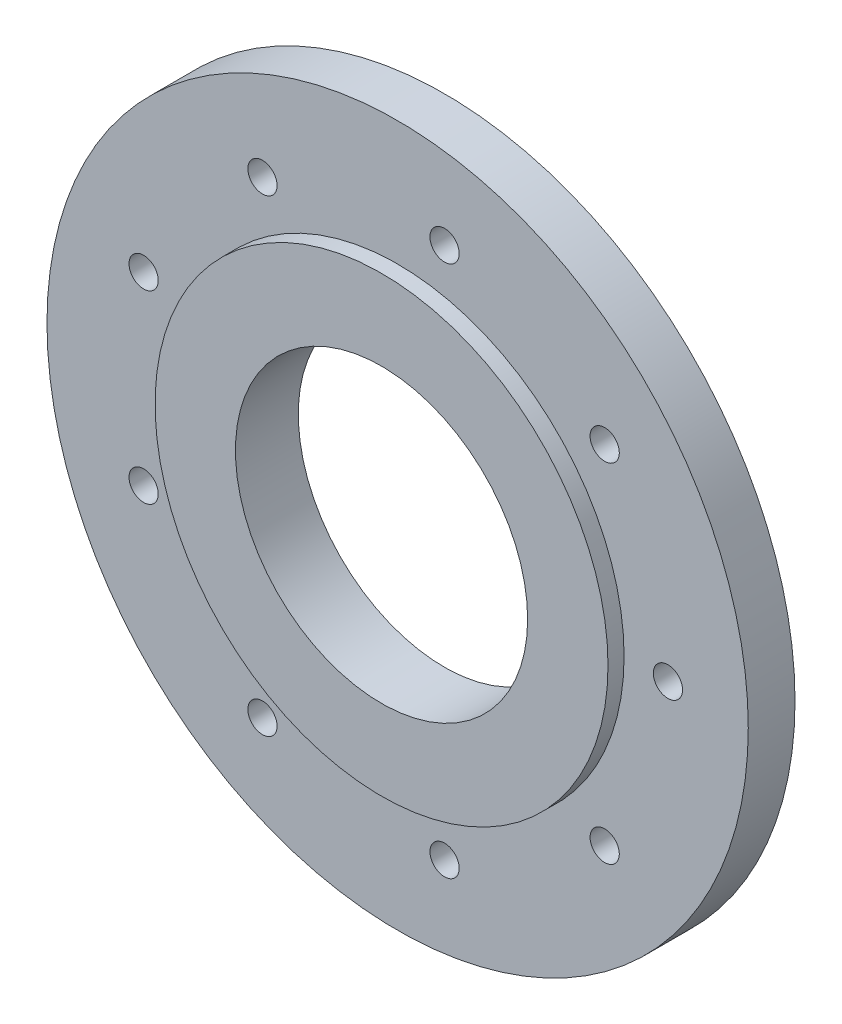
ISO-10303-21;
HEADER;
FILE_DESCRIPTION(('STEP AP214'),'2;1');
FILE_NAME('part.step','',(''),(''),'','','');
FILE_SCHEMA(('AUTOMOTIVE_DESIGN { 1 0 10303 214 1 1 1 1 }'));
ENDSEC;
DATA;
#1=APPLICATION_CONTEXT('core data for automotive mechanical design processes');
#2=APPLICATION_PROTOCOL_DEFINITION('international standard','automotive_design',2000,#1);
#3=PRODUCT_CONTEXT('',#1,'mechanical');
#4=PRODUCT('Part','Part','',(#3));
#5=PRODUCT_RELATED_PRODUCT_CATEGORY('part','',(#4));
#6=PRODUCT_DEFINITION_FORMATION('','',#4);
#7=PRODUCT_DEFINITION_CONTEXT('part definition',#1,'design');
#8=PRODUCT_DEFINITION('design','',#6,#7);
#9=PRODUCT_DEFINITION_SHAPE('','',#8);
#10=(LENGTH_UNIT() NAMED_UNIT(*) SI_UNIT(.MILLI.,.METRE.));
#11=(NAMED_UNIT(*) PLANE_ANGLE_UNIT() SI_UNIT($,.RADIAN.));
#12=(NAMED_UNIT(*) SI_UNIT($,.STERADIAN.) SOLID_ANGLE_UNIT());
#13=UNCERTAINTY_MEASURE_WITH_UNIT(LENGTH_MEASURE(1.E-05),#10,'distance_accuracy_value','');
#14=(GEOMETRIC_REPRESENTATION_CONTEXT(3) GLOBAL_UNCERTAINTY_ASSIGNED_CONTEXT((#13)) GLOBAL_UNIT_ASSIGNED_CONTEXT((#10,
#11,#12)) REPRESENTATION_CONTEXT('',''));
#15=CARTESIAN_POINT('',(0.,0.,0.));
#16=DIRECTION('',(0.,0.,1.));
#17=DIRECTION('',(1.,0.,0.));
#18=AXIS2_PLACEMENT_3D('',#15,#16,#17);
#19=CARTESIAN_POINT('',(0.,0.,21.5));
#20=DIRECTION('',(0.,0.,-1.));
#21=DIRECTION('',(-1.,0.,0.));
#22=AXIS2_PLACEMENT_3D('',#19,#20,#21);
#23=CYLINDRICAL_SURFACE('',#22,120.);
#24=CARTESIAN_POINT('',(0.,0.,0.));
#25=DIRECTION('',(0.,0.,1.));
#26=DIRECTION('',(1.,0.,0.));
#27=AXIS2_PLACEMENT_3D('',#24,#25,#26);
#28=CIRCLE('',#27,120.);
#29=CARTESIAN_POINT('',(120.,0.,0.));
#30=VERTEX_POINT('',#29);
#31=EDGE_CURVE('E11',#30,#30,#28,.T.);
#32=ORIENTED_EDGE('',*,*,#31,.T.);
#33=EDGE_LOOP('',(#32));
#34=FACE_BOUND('',#33,.T.);
#35=CARTESIAN_POINT('',(0.,0.,16.));
#36=DIRECTION('',(0.,0.,1.));
#37=DIRECTION('',(1.,0.,0.));
#38=AXIS2_PLACEMENT_3D('',#35,#36,#37);
#39=CIRCLE('',#38,120.);
#40=CARTESIAN_POINT('',(120.,0.,16.));
#41=VERTEX_POINT('',#40);
#42=EDGE_CURVE('E35',#41,#41,#39,.T.);
#43=ORIENTED_EDGE('',*,*,#42,.F.);
#44=EDGE_LOOP('',(#43));
#45=FACE_BOUND('',#44,.T.);
#46=ADVANCED_FACE('F32',(#34,#45),#23,.T.);
#47=CARTESIAN_POINT('',(0.,0.,0.));
#48=DIRECTION('',(0.,0.,1.));
#49=DIRECTION('',(1.,0.,0.));
#50=AXIS2_PLACEMENT_3D('',#47,#48,#49);
#51=PLANE('',#50);
#52=CARTESIAN_POINT('',(0.,0.,0.));
#53=DIRECTION('',(0.,0.,1.));
#54=DIRECTION('',(1.,0.,0.));
#55=AXIS2_PLACEMENT_3D('',#52,#53,#54);
#56=CIRCLE('',#55,50.);
#57=CARTESIAN_POINT('',(50.,0.,0.));
#58=VERTEX_POINT('',#57);
#59=EDGE_CURVE('E101',#58,#58,#56,.T.);
#60=ORIENTED_EDGE('',*,*,#59,.T.);
#61=EDGE_LOOP('',(#60));
#62=FACE_BOUND('',#61,.T.);
#63=CARTESIAN_POINT('',(70.8591109885062,-59.457853896004,0.));
#64=DIRECTION('',(0.,0.,1.));
#65=DIRECTION('',(0.766044443118986,-0.64278760968653,0.));
#66=AXIS2_PLACEMENT_3D('',#63,#64,#65);
#67=CIRCLE('',#66,5.);
#68=CARTESIAN_POINT('',(74.6893332041011,-62.6717919444367,0.));
#69=VERTEX_POINT('',#68);
#70=EDGE_CURVE('E95',#69,#69,#67,.T.);
#71=ORIENTED_EDGE('',*,*,#70,.T.);
#72=EDGE_LOOP('',(#71));
#73=FACE_BOUND('',#72,.T.);
#74=CARTESIAN_POINT('',(16.062456434192,-91.0947171536291,0.));
#75=DIRECTION('',(0.,0.,1.));
#76=DIRECTION('',(0.17364817766694,-0.984807753012206,0.));
#77=AXIS2_PLACEMENT_3D('',#74,#75,#76);
#78=CIRCLE('',#77,5.);
#79=CARTESIAN_POINT('',(16.9306973225267,-96.0187559186901,0.));
#80=VERTEX_POINT('',#79);
#81=EDGE_CURVE('E89',#80,#80,#78,.T.);
#82=ORIENTED_EDGE('',*,*,#81,.T.);
#83=EDGE_LOOP('',(#82));
#84=FACE_BOUND('',#83,.T.);
#85=CARTESIAN_POINT('',(-46.2499999999993,-80.107349850061,0.));
#86=DIRECTION('',(0.,0.,1.));
#87=DIRECTION('',(-0.499999999999992,-0.866025403784443,0.));
#88=AXIS2_PLACEMENT_3D('',#85,#86,#87);
#89=CIRCLE('',#88,5.);
#90=CARTESIAN_POINT('',(-48.7499999999992,-84.4374768689832,0.));
#91=VERTEX_POINT('',#90);
#92=EDGE_CURVE('E83',#91,#91,#89,.T.);
#93=ORIENTED_EDGE('',*,*,#92,.T.);
#94=EDGE_LOOP('',(#93));
#95=FACE_BOUND('',#94,.T.);
#96=CARTESIAN_POINT('',(-86.9215674226963,-31.636863257625,0.));
#97=DIRECTION('',(0.,0.,1.));
#98=DIRECTION('',(-0.939692620785906,-0.342020143325676,0.));
#99=AXIS2_PLACEMENT_3D('',#96,#97,#98);
#100=CIRCLE('',#99,5.);
#101=CARTESIAN_POINT('',(-91.6200305266258,-33.3469639742534,0.));
#102=VERTEX_POINT('',#101);
#103=EDGE_CURVE('E77',#102,#102,#100,.T.);
#104=ORIENTED_EDGE('',*,*,#103,.T.);
#105=EDGE_LOOP('',(#104));
#106=FACE_BOUND('',#105,.T.);
#107=CARTESIAN_POINT('',(-86.9215674226967,31.6368632576238,0.));
#108=DIRECTION('',(0.,0.,1.));
#109=DIRECTION('',(-0.939692620785911,0.342020143325663,0.));
#110=AXIS2_PLACEMENT_3D('',#107,#108,#109);
#111=CIRCLE('',#110,5.);
#112=CARTESIAN_POINT('',(-91.6200305266263,33.3469639742522,0.));
#113=VERTEX_POINT('',#112);
#114=EDGE_CURVE('E71',#113,#113,#111,.T.);
#115=ORIENTED_EDGE('',*,*,#114,.T.);
#116=EDGE_LOOP('',(#115));
#117=FACE_BOUND('',#116,.T.);
#118=CARTESIAN_POINT('',(-46.2500000000004,80.1073498500604,0.));
#119=DIRECTION('',(0.,0.,1.));
#120=DIRECTION('',(-0.500000000000004,0.866025403784436,0.));
#121=AXIS2_PLACEMENT_3D('',#118,#119,#120);
#122=CIRCLE('',#121,5.);
#123=CARTESIAN_POINT('',(-48.7500000000004,84.4374768689826,0.));
#124=VERTEX_POINT('',#123);
#125=EDGE_CURVE('E65',#124,#124,#122,.T.);
#126=ORIENTED_EDGE('',*,*,#125,.T.);
#127=EDGE_LOOP('',(#126));
#128=FACE_BOUND('',#127,.T.);
#129=CARTESIAN_POINT('',(16.0624564341908,91.0947171536293,0.));
#130=DIRECTION('',(0.,0.,1.));
#131=DIRECTION('',(0.173648177666927,0.984807753012209,0.));
#132=AXIS2_PLACEMENT_3D('',#129,#130,#131);
#133=CIRCLE('',#132,5.);
#134=CARTESIAN_POINT('',(16.9306973225254,96.0187559186903,0.));
#135=VERTEX_POINT('',#134);
#136=EDGE_CURVE('E59',#135,#135,#133,.T.);
#137=ORIENTED_EDGE('',*,*,#136,.T.);
#138=EDGE_LOOP('',(#137));
#139=FACE_BOUND('',#138,.T.);
#140=CARTESIAN_POINT('',(70.8591109885054,59.457853896005,0.));
#141=DIRECTION('',(0.,0.,1.));
#142=DIRECTION('',(0.766044443118977,0.642787609686541,0.));
#143=AXIS2_PLACEMENT_3D('',#140,#141,#142);
#144=CIRCLE('',#143,5.);
#145=CARTESIAN_POINT('',(74.6893332041003,62.6717919444377,0.));
#146=VERTEX_POINT('',#145);
#147=EDGE_CURVE('E53',#146,#146,#144,.T.);
#148=ORIENTED_EDGE('',*,*,#147,.T.);
#149=EDGE_LOOP('',(#148));
#150=FACE_BOUND('',#149,.T.);
#151=CARTESIAN_POINT('',(92.5,0.,0.));
#152=DIRECTION('',(0.,0.,1.));
#153=DIRECTION('',(1.,0.,0.));
#154=AXIS2_PLACEMENT_3D('',#151,#152,#153);
#155=CIRCLE('',#154,5.);
#156=CARTESIAN_POINT('',(97.5,0.,0.));
#157=VERTEX_POINT('',#156);
#158=EDGE_CURVE('E47',#157,#157,#155,.T.);
#159=ORIENTED_EDGE('',*,*,#158,.T.);
#160=EDGE_LOOP('',(#159));
#161=FACE_BOUND('',#160,.T.);
#162=ORIENTED_EDGE('',*,*,#31,.F.);
#163=EDGE_LOOP('',(#162));
#164=FACE_BOUND('',#163,.T.);
#165=ADVANCED_FACE('F110',(#62,#73,#84,#95,#106,#117,#128,#139,#150,#161,#164),#51,.F.);
#166=CARTESIAN_POINT('',(0.,0.,16.));
#167=DIRECTION('',(0.,0.,1.));
#168=DIRECTION('',(1.,0.,0.));
#169=AXIS2_PLACEMENT_3D('',#166,#167,#168);
#170=PLANE('',#169);
#171=CARTESIAN_POINT('',(70.8591109885062,-59.457853896004,16.));
#172=DIRECTION('',(0.,0.,1.));
#173=DIRECTION('',(0.766044443118986,-0.64278760968653,0.));
#174=AXIS2_PLACEMENT_3D('',#171,#172,#173);
#175=CIRCLE('',#174,5.);
#176=CARTESIAN_POINT('',(74.6893332041011,-62.6717919444367,16.));
#177=VERTEX_POINT('',#176);
#178=EDGE_CURVE('E98',#177,#177,#175,.T.);
#179=ORIENTED_EDGE('',*,*,#178,.F.);
#180=EDGE_LOOP('',(#179));
#181=FACE_BOUND('',#180,.T.);
#182=CARTESIAN_POINT('',(16.062456434192,-91.0947171536291,16.));
#183=DIRECTION('',(0.,0.,1.));
#184=DIRECTION('',(0.17364817766694,-0.984807753012206,0.));
#185=AXIS2_PLACEMENT_3D('',#182,#183,#184);
#186=CIRCLE('',#185,5.);
#187=CARTESIAN_POINT('',(16.9306973225267,-96.0187559186901,16.));
#188=VERTEX_POINT('',#187);
#189=EDGE_CURVE('E92',#188,#188,#186,.T.);
#190=ORIENTED_EDGE('',*,*,#189,.F.);
#191=EDGE_LOOP('',(#190));
#192=FACE_BOUND('',#191,.T.);
#193=CARTESIAN_POINT('',(-46.2499999999993,-80.107349850061,16.));
#194=DIRECTION('',(0.,0.,1.));
#195=DIRECTION('',(-0.499999999999992,-0.866025403784443,0.));
#196=AXIS2_PLACEMENT_3D('',#193,#194,#195);
#197=CIRCLE('',#196,5.);
#198=CARTESIAN_POINT('',(-48.7499999999992,-84.4374768689832,16.));
#199=VERTEX_POINT('',#198);
#200=EDGE_CURVE('E86',#199,#199,#197,.T.);
#201=ORIENTED_EDGE('',*,*,#200,.F.);
#202=EDGE_LOOP('',(#201));
#203=FACE_BOUND('',#202,.T.);
#204=CARTESIAN_POINT('',(-86.9215674226963,-31.636863257625,16.));
#205=DIRECTION('',(0.,0.,1.));
#206=DIRECTION('',(-0.939692620785906,-0.342020143325676,0.));
#207=AXIS2_PLACEMENT_3D('',#204,#205,#206);
#208=CIRCLE('',#207,5.);
#209=CARTESIAN_POINT('',(-91.6200305266258,-33.3469639742534,16.));
#210=VERTEX_POINT('',#209);
#211=EDGE_CURVE('E80',#210,#210,#208,.T.);
#212=ORIENTED_EDGE('',*,*,#211,.F.);
#213=EDGE_LOOP('',(#212));
#214=FACE_BOUND('',#213,.T.);
#215=CARTESIAN_POINT('',(-86.9215674226967,31.6368632576238,16.));
#216=DIRECTION('',(0.,0.,1.));
#217=DIRECTION('',(-0.939692620785911,0.342020143325663,0.));
#218=AXIS2_PLACEMENT_3D('',#215,#216,#217);
#219=CIRCLE('',#218,5.);
#220=CARTESIAN_POINT('',(-91.6200305266263,33.3469639742522,16.));
#221=VERTEX_POINT('',#220);
#222=EDGE_CURVE('E74',#221,#221,#219,.T.);
#223=ORIENTED_EDGE('',*,*,#222,.F.);
#224=EDGE_LOOP('',(#223));
#225=FACE_BOUND('',#224,.T.);
#226=CARTESIAN_POINT('',(-46.2500000000004,80.1073498500604,16.));
#227=DIRECTION('',(0.,0.,1.));
#228=DIRECTION('',(-0.500000000000004,0.866025403784436,0.));
#229=AXIS2_PLACEMENT_3D('',#226,#227,#228);
#230=CIRCLE('',#229,5.);
#231=CARTESIAN_POINT('',(-48.7500000000004,84.4374768689826,16.));
#232=VERTEX_POINT('',#231);
#233=EDGE_CURVE('E68',#232,#232,#230,.T.);
#234=ORIENTED_EDGE('',*,*,#233,.F.);
#235=EDGE_LOOP('',(#234));
#236=FACE_BOUND('',#235,.T.);
#237=CARTESIAN_POINT('',(16.0624564341908,91.0947171536293,16.));
#238=DIRECTION('',(0.,0.,1.));
#239=DIRECTION('',(0.173648177666927,0.984807753012209,0.));
#240=AXIS2_PLACEMENT_3D('',#237,#238,#239);
#241=CIRCLE('',#240,5.);
#242=CARTESIAN_POINT('',(16.9306973225254,96.0187559186903,16.));
#243=VERTEX_POINT('',#242);
#244=EDGE_CURVE('E62',#243,#243,#241,.T.);
#245=ORIENTED_EDGE('',*,*,#244,.F.);
#246=EDGE_LOOP('',(#245));
#247=FACE_BOUND('',#246,.T.);
#248=CARTESIAN_POINT('',(70.8591109885054,59.457853896005,16.));
#249=DIRECTION('',(0.,0.,1.));
#250=DIRECTION('',(0.766044443118977,0.642787609686541,0.));
#251=AXIS2_PLACEMENT_3D('',#248,#249,#250);
#252=CIRCLE('',#251,5.);
#253=CARTESIAN_POINT('',(74.6893332041003,62.6717919444377,16.));
#254=VERTEX_POINT('',#253);
#255=EDGE_CURVE('E56',#254,#254,#252,.T.);
#256=ORIENTED_EDGE('',*,*,#255,.F.);
#257=EDGE_LOOP('',(#256));
#258=FACE_BOUND('',#257,.T.);
#259=CARTESIAN_POINT('',(92.5,0.,16.));
#260=DIRECTION('',(0.,0.,1.));
#261=DIRECTION('',(1.,0.,0.));
#262=AXIS2_PLACEMENT_3D('',#259,#260,#261);
#263=CIRCLE('',#262,5.);
#264=CARTESIAN_POINT('',(97.5,0.,16.));
#265=VERTEX_POINT('',#264);
#266=EDGE_CURVE('E50',#265,#265,#263,.T.);
#267=ORIENTED_EDGE('',*,*,#266,.F.);
#268=EDGE_LOOP('',(#267));
#269=FACE_BOUND('',#268,.T.);
#270=CARTESIAN_POINT('',(0.,0.,16.));
#271=DIRECTION('',(0.,0.,1.));
#272=DIRECTION('',(1.,0.,0.));
#273=AXIS2_PLACEMENT_3D('',#270,#271,#272);
#274=CIRCLE('',#273,77.5);
#275=CARTESIAN_POINT('',(77.5,0.,16.));
#276=VERTEX_POINT('',#275);
#277=EDGE_CURVE('E42',#276,#276,#274,.T.);
#278=ORIENTED_EDGE('',*,*,#277,.F.);
#279=EDGE_LOOP('',(#278));
#280=FACE_BOUND('',#279,.T.);
#281=ORIENTED_EDGE('',*,*,#42,.T.);
#282=EDGE_LOOP('',(#281));
#283=FACE_BOUND('',#282,.T.);
#284=ADVANCED_FACE('F129',(#181,#192,#203,#214,#225,#236,#247,#258,#269,#280,#283),#170,.T.);
#285=CARTESIAN_POINT('',(0.,0.,16.));
#286=DIRECTION('',(0.,0.,1.));
#287=DIRECTION('',(1.,0.,0.));
#288=AXIS2_PLACEMENT_3D('',#285,#286,#287);
#289=CYLINDRICAL_SURFACE('',#288,77.5);
#290=ORIENTED_EDGE('',*,*,#277,.T.);
#291=EDGE_LOOP('',(#290));
#292=FACE_BOUND('',#291,.T.);
#293=CARTESIAN_POINT('',(0.,0.,21.5));
#294=DIRECTION('',(0.,0.,1.));
#295=DIRECTION('',(1.,0.,0.));
#296=AXIS2_PLACEMENT_3D('',#293,#294,#295);
#297=CIRCLE('',#296,77.5);
#298=CARTESIAN_POINT('',(77.5,0.,21.5));
#299=VERTEX_POINT('',#298);
#300=EDGE_CURVE('E44',#299,#299,#297,.T.);
#301=ORIENTED_EDGE('',*,*,#300,.F.);
#302=EDGE_LOOP('',(#301));
#303=FACE_BOUND('',#302,.T.);
#304=ADVANCED_FACE('F124',(#292,#303),#289,.T.);
#305=CARTESIAN_POINT('',(0.,0.,21.5));
#306=DIRECTION('',(0.,0.,1.));
#307=DIRECTION('',(1.,0.,0.));
#308=AXIS2_PLACEMENT_3D('',#305,#306,#307);
#309=PLANE('',#308);
#310=CARTESIAN_POINT('',(0.,0.,21.5));
#311=DIRECTION('',(0.,0.,1.));
#312=DIRECTION('',(1.,0.,0.));
#313=AXIS2_PLACEMENT_3D('',#310,#311,#312);
#314=CIRCLE('',#313,50.);
#315=CARTESIAN_POINT('',(50.,0.,21.5));
#316=VERTEX_POINT('',#315);
#317=EDGE_CURVE('E104',#316,#316,#314,.T.);
#318=ORIENTED_EDGE('',*,*,#317,.F.);
#319=EDGE_LOOP('',(#318));
#320=FACE_BOUND('',#319,.T.);
#321=ORIENTED_EDGE('',*,*,#300,.T.);
#322=EDGE_LOOP('',(#321));
#323=FACE_BOUND('',#322,.T.);
#324=ADVANCED_FACE('F120',(#320,#323),#309,.T.);
#325=CARTESIAN_POINT('',(92.5,0.,0.));
#326=DIRECTION('',(0.,0.,1.));
#327=DIRECTION('',(1.,0.,0.));
#328=AXIS2_PLACEMENT_3D('',#325,#326,#327);
#329=CYLINDRICAL_SURFACE('',#328,5.);
#330=ORIENTED_EDGE('',*,*,#158,.F.);
#331=EDGE_LOOP('',(#330));
#332=FACE_BOUND('',#331,.T.);
#333=ORIENTED_EDGE('',*,*,#266,.T.);
#334=EDGE_LOOP('',(#333));
#335=FACE_BOUND('',#334,.T.);
#336=ADVANCED_FACE('F123',(#332,#335),#329,.F.);
#337=CARTESIAN_POINT('',(70.8591109885054,59.457853896005,0.));
#338=DIRECTION('',(0.,0.,1.));
#339=DIRECTION('',(1.,0.,0.));
#340=AXIS2_PLACEMENT_3D('',#337,#338,#339);
#341=CYLINDRICAL_SURFACE('',#340,5.);
#342=ORIENTED_EDGE('',*,*,#147,.F.);
#343=EDGE_LOOP('',(#342));
#344=FACE_BOUND('',#343,.T.);
#345=ORIENTED_EDGE('',*,*,#255,.T.);
#346=EDGE_LOOP('',(#345));
#347=FACE_BOUND('',#346,.T.);
#348=ADVANCED_FACE('F164',(#344,#347),#341,.F.);
#349=CARTESIAN_POINT('',(16.0624564341908,91.0947171536293,0.));
#350=DIRECTION('',(0.,0.,1.));
#351=DIRECTION('',(1.,0.,0.));
#352=AXIS2_PLACEMENT_3D('',#349,#350,#351);
#353=CYLINDRICAL_SURFACE('',#352,5.);
#354=ORIENTED_EDGE('',*,*,#136,.F.);
#355=EDGE_LOOP('',(#354));
#356=FACE_BOUND('',#355,.T.);
#357=ORIENTED_EDGE('',*,*,#244,.T.);
#358=EDGE_LOOP('',(#357));
#359=FACE_BOUND('',#358,.T.);
#360=ADVANCED_FACE('F169',(#356,#359),#353,.F.);
#361=CARTESIAN_POINT('',(-46.2500000000004,80.1073498500604,0.));
#362=DIRECTION('',(0.,0.,1.));
#363=DIRECTION('',(1.,0.,0.));
#364=AXIS2_PLACEMENT_3D('',#361,#362,#363);
#365=CYLINDRICAL_SURFACE('',#364,5.);
#366=ORIENTED_EDGE('',*,*,#125,.F.);
#367=EDGE_LOOP('',(#366));
#368=FACE_BOUND('',#367,.T.);
#369=ORIENTED_EDGE('',*,*,#233,.T.);
#370=EDGE_LOOP('',(#369));
#371=FACE_BOUND('',#370,.T.);
#372=ADVANCED_FACE('F179',(#368,#371),#365,.F.);
#373=CARTESIAN_POINT('',(-86.9215674226967,31.6368632576238,0.));
#374=DIRECTION('',(0.,0.,1.));
#375=DIRECTION('',(1.,0.,0.));
#376=AXIS2_PLACEMENT_3D('',#373,#374,#375);
#377=CYLINDRICAL_SURFACE('',#376,5.);
#378=ORIENTED_EDGE('',*,*,#114,.F.);
#379=EDGE_LOOP('',(#378));
#380=FACE_BOUND('',#379,.T.);
#381=ORIENTED_EDGE('',*,*,#222,.T.);
#382=EDGE_LOOP('',(#381));
#383=FACE_BOUND('',#382,.T.);
#384=ADVANCED_FACE('F189',(#380,#383),#377,.F.);
#385=CARTESIAN_POINT('',(-86.9215674226963,-31.636863257625,0.));
#386=DIRECTION('',(0.,0.,1.));
#387=DIRECTION('',(1.,0.,0.));
#388=AXIS2_PLACEMENT_3D('',#385,#386,#387);
#389=CYLINDRICAL_SURFACE('',#388,5.);
#390=ORIENTED_EDGE('',*,*,#103,.F.);
#391=EDGE_LOOP('',(#390));
#392=FACE_BOUND('',#391,.T.);
#393=ORIENTED_EDGE('',*,*,#211,.T.);
#394=EDGE_LOOP('',(#393));
#395=FACE_BOUND('',#394,.T.);
#396=ADVANCED_FACE('F199',(#392,#395),#389,.F.);
#397=CARTESIAN_POINT('',(-46.2499999999993,-80.107349850061,0.));
#398=DIRECTION('',(0.,0.,1.));
#399=DIRECTION('',(1.,0.,0.));
#400=AXIS2_PLACEMENT_3D('',#397,#398,#399);
#401=CYLINDRICAL_SURFACE('',#400,5.);
#402=ORIENTED_EDGE('',*,*,#92,.F.);
#403=EDGE_LOOP('',(#402));
#404=FACE_BOUND('',#403,.T.);
#405=ORIENTED_EDGE('',*,*,#200,.T.);
#406=EDGE_LOOP('',(#405));
#407=FACE_BOUND('',#406,.T.);
#408=ADVANCED_FACE('F209',(#404,#407),#401,.F.);
#409=CARTESIAN_POINT('',(16.062456434192,-91.0947171536291,0.));
#410=DIRECTION('',(0.,0.,1.));
#411=DIRECTION('',(1.,0.,0.));
#412=AXIS2_PLACEMENT_3D('',#409,#410,#411);
#413=CYLINDRICAL_SURFACE('',#412,5.);
#414=ORIENTED_EDGE('',*,*,#81,.F.);
#415=EDGE_LOOP('',(#414));
#416=FACE_BOUND('',#415,.T.);
#417=ORIENTED_EDGE('',*,*,#189,.T.);
#418=EDGE_LOOP('',(#417));
#419=FACE_BOUND('',#418,.T.);
#420=ADVANCED_FACE('F219',(#416,#419),#413,.F.);
#421=CARTESIAN_POINT('',(70.8591109885062,-59.457853896004,0.));
#422=DIRECTION('',(0.,0.,1.));
#423=DIRECTION('',(1.,0.,0.));
#424=AXIS2_PLACEMENT_3D('',#421,#422,#423);
#425=CYLINDRICAL_SURFACE('',#424,5.);
#426=ORIENTED_EDGE('',*,*,#70,.F.);
#427=EDGE_LOOP('',(#426));
#428=FACE_BOUND('',#427,.T.);
#429=ORIENTED_EDGE('',*,*,#178,.T.);
#430=EDGE_LOOP('',(#429));
#431=FACE_BOUND('',#430,.T.);
#432=ADVANCED_FACE('F116',(#428,#431),#425,.F.);
#433=CARTESIAN_POINT('',(0.,0.,0.));
#434=DIRECTION('',(0.,0.,1.));
#435=DIRECTION('',(1.,0.,0.));
#436=AXIS2_PLACEMENT_3D('',#433,#434,#435);
#437=CYLINDRICAL_SURFACE('',#436,50.);
#438=ORIENTED_EDGE('',*,*,#59,.F.);
#439=EDGE_LOOP('',(#438));
#440=FACE_BOUND('',#439,.T.);
#441=ORIENTED_EDGE('',*,*,#317,.T.);
#442=EDGE_LOOP('',(#441));
#443=FACE_BOUND('',#442,.T.);
#444=ADVANCED_FACE('F113',(#440,#443),#437,.F.);
#445=CLOSED_SHELL('',(#46,#165,#284,#304,#324,#336,#348,#360,#372,#384,#396,#408,#420,#432,#444));
#446=MANIFOLD_SOLID_BREP('B2',#445);
#447=ADVANCED_BREP_SHAPE_REPRESENTATION('',(#18,#446),#14);
#448=SHAPE_DEFINITION_REPRESENTATION(#9,#447);
ENDSEC;
END-ISO-10303-21;
